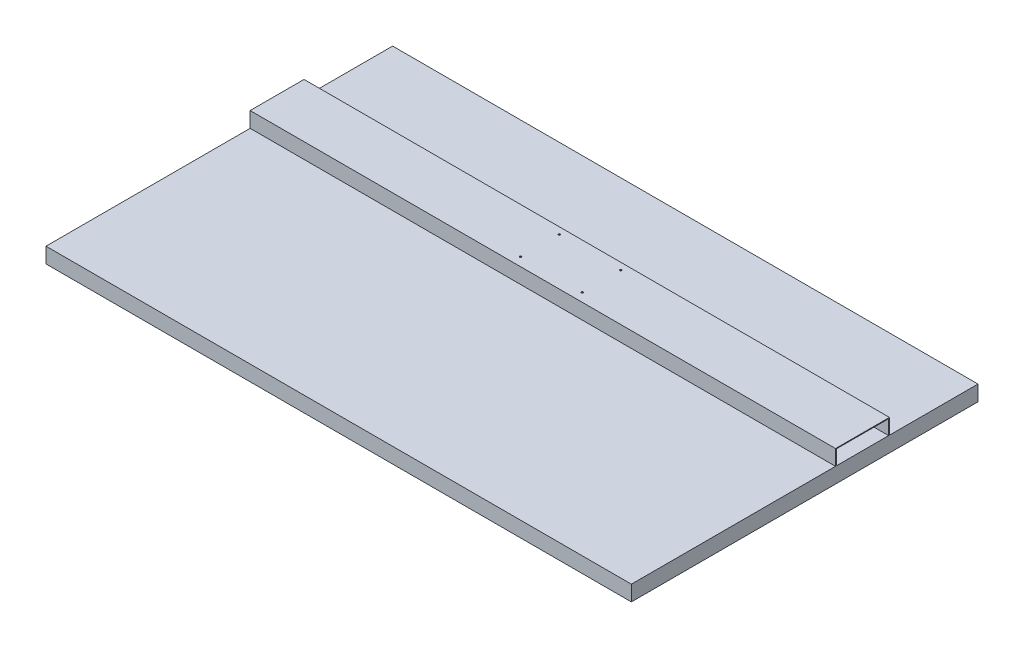
ISO-10303-21;
HEADER;
FILE_DESCRIPTION(('STEP AP214'),'2;1');
FILE_NAME('part.step','',(''),(''),'','','');
FILE_SCHEMA(('AUTOMOTIVE_DESIGN { 1 0 10303 214 1 1 1 1 }'));
ENDSEC;
DATA;
#1=APPLICATION_CONTEXT('core data for automotive mechanical design processes');
#2=APPLICATION_PROTOCOL_DEFINITION('international standard','automotive_design',2000,#1);
#3=PRODUCT_CONTEXT('',#1,'mechanical');
#4=PRODUCT('Part','Part','',(#3));
#5=PRODUCT_RELATED_PRODUCT_CATEGORY('part','',(#4));
#6=PRODUCT_DEFINITION_FORMATION('','',#4);
#7=PRODUCT_DEFINITION_CONTEXT('part definition',#1,'design');
#8=PRODUCT_DEFINITION('design','',#6,#7);
#9=PRODUCT_DEFINITION_SHAPE('','',#8);
#10=(LENGTH_UNIT() NAMED_UNIT(*) SI_UNIT(.MILLI.,.METRE.));
#11=(NAMED_UNIT(*) PLANE_ANGLE_UNIT() SI_UNIT($,.RADIAN.));
#12=(NAMED_UNIT(*) SI_UNIT($,.STERADIAN.) SOLID_ANGLE_UNIT());
#13=UNCERTAINTY_MEASURE_WITH_UNIT(LENGTH_MEASURE(1.E-05),#10,'distance_accuracy_value','');
#14=(GEOMETRIC_REPRESENTATION_CONTEXT(3) GLOBAL_UNCERTAINTY_ASSIGNED_CONTEXT((#13)) GLOBAL_UNIT_ASSIGNED_CONTEXT((#10,
#11,#12)) REPRESENTATION_CONTEXT('',''));
#15=CARTESIAN_POINT('',(0.,0.,0.));
#16=DIRECTION('',(0.,0.,1.));
#17=DIRECTION('',(1.,0.,0.));
#18=AXIS2_PLACEMENT_3D('',#15,#16,#17);
#19=CARTESIAN_POINT('',(0.,50.8,0.));
#20=DIRECTION('',(0.,1.,0.));
#21=DIRECTION('',(0.,0.,1.));
#22=AXIS2_PLACEMENT_3D('',#19,#20,#21);
#23=PLANE('',#22);
#24=DIRECTION('',(1.,0.,0.));
#25=VECTOR('',#24,1.);
#26=CARTESIAN_POINT('',(-965.2,50.8,-279.4));
#27=LINE('',#26,#25);
#28=CARTESIAN_POINT('',(-965.2,50.8,-279.4));
#29=VERTEX_POINT('',#28);
#30=CARTESIAN_POINT('',(965.199999999999,50.8,-279.4));
#31=VERTEX_POINT('',#30);
#32=EDGE_CURVE('E211',#29,#31,#27,.T.);
#33=ORIENTED_EDGE('',*,*,#32,.T.);
#34=DIRECTION('',(0.,0.,-1.));
#35=VECTOR('',#34,1.);
#36=CARTESIAN_POINT('',(965.199999999999,50.8,-571.5));
#37=LINE('',#36,#35);
#38=CARTESIAN_POINT('',(965.199999999999,50.8,-571.5));
#39=VERTEX_POINT('',#38);
#40=EDGE_CURVE('E255',#31,#39,#37,.T.);
#41=ORIENTED_EDGE('',*,*,#40,.T.);
#42=DIRECTION('',(-1.,0.,0.));
#43=VECTOR('',#42,1.);
#44=CARTESIAN_POINT('',(-965.2,50.8,-571.5));
#45=LINE('',#44,#43);
#46=CARTESIAN_POINT('',(-965.2,50.8,-571.5));
#47=VERTEX_POINT('',#46);
#48=EDGE_CURVE('E253',#39,#47,#45,.T.);
#49=ORIENTED_EDGE('',*,*,#48,.T.);
#50=DIRECTION('',(0.,0.,1.));
#51=VECTOR('',#50,1.);
#52=CARTESIAN_POINT('',(-965.2,50.8,-571.5));
#53=LINE('',#52,#51);
#54=EDGE_CURVE('E258',#47,#29,#53,.T.);
#55=ORIENTED_EDGE('',*,*,#54,.T.);
#56=EDGE_LOOP('',(#33,#41,#49,#55));
#57=FACE_BOUND('',#56,.T.);
#58=ADVANCED_FACE('F41',(#57),#23,.T.);
#59=DIRECTION('',(1.,0.,0.));
#60=VECTOR('',#59,1.);
#61=CARTESIAN_POINT('',(-965.2,50.8,-101.6));
#62=LINE('',#61,#60);
#63=CARTESIAN_POINT('',(-965.2,50.8,-101.6));
#64=VERTEX_POINT('',#63);
#65=CARTESIAN_POINT('',(965.199999999999,50.8,-101.6));
#66=VERTEX_POINT('',#65);
#67=EDGE_CURVE('E56',#64,#66,#62,.T.);
#68=ORIENTED_EDGE('',*,*,#67,.F.);
#69=CARTESIAN_POINT('',(-965.2,50.8,571.5));
#70=VERTEX_POINT('',#69);
#71=EDGE_CURVE('E257',#64,#70,#53,.T.);
#72=ORIENTED_EDGE('',*,*,#71,.T.);
#73=DIRECTION('',(1.,0.,0.));
#74=VECTOR('',#73,1.);
#75=CARTESIAN_POINT('',(-965.2,50.8,571.5));
#76=LINE('',#75,#74);
#77=CARTESIAN_POINT('',(965.2,50.8,571.5));
#78=VERTEX_POINT('',#77);
#79=EDGE_CURVE('E260',#70,#78,#76,.T.);
#80=ORIENTED_EDGE('',*,*,#79,.T.);
#81=EDGE_CURVE('E251',#78,#66,#37,.T.);
#82=ORIENTED_EDGE('',*,*,#81,.T.);
#83=EDGE_LOOP('',(#68,#72,#80,#82));
#84=FACE_BOUND('',#83,.T.);
#85=ADVANCED_FACE('F298',(#84),#23,.T.);
#86=CARTESIAN_POINT('',(0.,0.,0.));
#87=DIRECTION('',(0.,1.,0.));
#88=DIRECTION('',(0.,0.,1.));
#89=AXIS2_PLACEMENT_3D('',#86,#87,#88);
#90=PLANE('',#89);
#91=DIRECTION('',(0.,0.,-1.));
#92=VECTOR('',#91,1.);
#93=CARTESIAN_POINT('',(965.199999999999,0.,-571.5));
#94=LINE('',#93,#92);
#95=CARTESIAN_POINT('',(965.2,0.,571.5));
#96=VERTEX_POINT('',#95);
#97=CARTESIAN_POINT('',(965.199999999999,0.,-571.5));
#98=VERTEX_POINT('',#97);
#99=EDGE_CURVE('E250',#96,#98,#94,.T.);
#100=ORIENTED_EDGE('',*,*,#99,.F.);
#101=DIRECTION('',(1.,0.,0.));
#102=VECTOR('',#101,1.);
#103=CARTESIAN_POINT('',(-965.2,0.,571.5));
#104=LINE('',#103,#102);
#105=CARTESIAN_POINT('',(-965.2,0.,571.5));
#106=VERTEX_POINT('',#105);
#107=EDGE_CURVE('E269',#106,#96,#104,.T.);
#108=ORIENTED_EDGE('',*,*,#107,.F.);
#109=DIRECTION('',(0.,0.,1.));
#110=VECTOR('',#109,1.);
#111=CARTESIAN_POINT('',(-965.2,0.,-571.5));
#112=LINE('',#111,#110);
#113=CARTESIAN_POINT('',(-965.2,0.,-571.5));
#114=VERTEX_POINT('',#113);
#115=EDGE_CURVE('E267',#114,#106,#112,.T.);
#116=ORIENTED_EDGE('',*,*,#115,.F.);
#117=DIRECTION('',(-1.,0.,0.));
#118=VECTOR('',#117,1.);
#119=CARTESIAN_POINT('',(-965.2,0.,-571.5));
#120=LINE('',#119,#118);
#121=EDGE_CURVE('E265',#98,#114,#120,.T.);
#122=ORIENTED_EDGE('',*,*,#121,.F.);
#123=EDGE_LOOP('',(#100,#108,#116,#122));
#124=FACE_BOUND('',#123,.T.);
#125=DIRECTION('',(0.,0.,-1.));
#126=VECTOR('',#125,1.);
#127=CARTESIAN_POINT('',(930.881156145277,0.,-534.820170657997));
#128=LINE('',#127,#126);
#129=CARTESIAN_POINT('',(930.881156145277,0.,534.820170657998));
#130=VERTEX_POINT('',#129);
#131=CARTESIAN_POINT('',(930.881156145277,0.,-534.820170657997));
#132=VERTEX_POINT('',#131);
#133=EDGE_CURVE('E208',#130,#132,#128,.T.);
#134=ORIENTED_EDGE('',*,*,#133,.T.);
#135=DIRECTION('',(-1.,0.,0.));
#136=VECTOR('',#135,1.);
#137=CARTESIAN_POINT('',(-930.881156145277,0.,-534.820170657997));
#138=LINE('',#137,#136);
#139=CARTESIAN_POINT('',(-930.881156145277,0.,-534.820170657997));
#140=VERTEX_POINT('',#139);
#141=EDGE_CURVE('E233',#132,#140,#138,.T.);
#142=ORIENTED_EDGE('',*,*,#141,.T.);
#143=DIRECTION('',(0.,0.,1.));
#144=VECTOR('',#143,1.);
#145=CARTESIAN_POINT('',(-930.881156145277,0.,-534.820170657997));
#146=LINE('',#145,#144);
#147=CARTESIAN_POINT('',(-930.881156145277,0.,534.820170657998));
#148=VERTEX_POINT('',#147);
#149=EDGE_CURVE('E236',#140,#148,#146,.T.);
#150=ORIENTED_EDGE('',*,*,#149,.T.);
#151=DIRECTION('',(1.,0.,0.));
#152=VECTOR('',#151,1.);
#153=CARTESIAN_POINT('',(-930.881156145277,0.,534.820170657998));
#154=LINE('',#153,#152);
#155=EDGE_CURVE('E224',#148,#130,#154,.T.);
#156=ORIENTED_EDGE('',*,*,#155,.T.);
#157=EDGE_LOOP('',(#134,#142,#150,#156));
#158=FACE_BOUND('',#157,.T.);
#159=ADVANCED_FACE('F287',(#124,#158),#90,.F.);
#160=CARTESIAN_POINT('',(965.199999999999,50.8,-571.5));
#161=DIRECTION('',(-1.,0.,0.));
#162=DIRECTION('',(0.,0.,1.));
#163=AXIS2_PLACEMENT_3D('',#160,#161,#162);
#164=PLANE('',#163);
#165=ORIENTED_EDGE('',*,*,#40,.F.);
#166=DIRECTION('',(0.,1.,0.));
#167=VECTOR('',#166,1.);
#168=CARTESIAN_POINT('',(965.199999999999,50.8,-279.4));
#169=LINE('',#168,#167);
#170=CARTESIAN_POINT('',(965.199999999999,101.6,-279.4));
#171=VERTEX_POINT('',#170);
#172=EDGE_CURVE('E201',#31,#171,#169,.T.);
#173=ORIENTED_EDGE('',*,*,#172,.T.);
#174=DIRECTION('',(0.,0.,1.));
#175=VECTOR('',#174,1.);
#176=CARTESIAN_POINT('',(965.199999999999,101.6,-101.6));
#177=LINE('',#176,#175);
#178=CARTESIAN_POINT('',(965.199999999999,101.6,-101.6));
#179=VERTEX_POINT('',#178);
#180=EDGE_CURVE('E180',#171,#179,#177,.T.);
#181=ORIENTED_EDGE('',*,*,#180,.T.);
#182=DIRECTION('',(0.,-1.,0.));
#183=VECTOR('',#182,1.);
#184=CARTESIAN_POINT('',(965.199999999999,50.8,-101.6));
#185=LINE('',#184,#183);
#186=EDGE_CURVE('E191',#179,#66,#185,.T.);
#187=ORIENTED_EDGE('',*,*,#186,.T.);
#188=ORIENTED_EDGE('',*,*,#81,.F.);
#189=DIRECTION('',(0.,-1.,0.));
#190=VECTOR('',#189,1.);
#191=CARTESIAN_POINT('',(965.2,50.8,571.5));
#192=LINE('',#191,#190);
#193=EDGE_CURVE('E262',#78,#96,#192,.T.);
#194=ORIENTED_EDGE('',*,*,#193,.T.);
#195=ORIENTED_EDGE('',*,*,#99,.T.);
#196=DIRECTION('',(0.,-1.,0.));
#197=VECTOR('',#196,1.);
#198=CARTESIAN_POINT('',(965.199999999999,50.8,-571.5));
#199=LINE('',#198,#197);
#200=EDGE_CURVE('E11',#39,#98,#199,.T.);
#201=ORIENTED_EDGE('',*,*,#200,.F.);
#202=EDGE_LOOP('',(#165,#173,#181,#187,#188,#194,#195,#201));
#203=FACE_BOUND('',#202,.T.);
#204=DIRECTION('',(0.,-1.,0.));
#205=VECTOR('',#204,1.);
#206=CARTESIAN_POINT('',(965.199999999999,50.8,-276.86));
#207=LINE('',#206,#205);
#208=CARTESIAN_POINT('',(965.199999999999,99.06,-276.86));
#209=VERTEX_POINT('',#208);
#210=CARTESIAN_POINT('',(965.199999999999,50.8,-276.86));
#211=VERTEX_POINT('',#210);
#212=EDGE_CURVE('E198',#209,#211,#207,.T.);
#213=ORIENTED_EDGE('',*,*,#212,.T.);
#214=CARTESIAN_POINT('',(965.199999999999,50.8,-104.14));
#215=VERTEX_POINT('',#214);
#216=EDGE_CURVE('E254',#215,#211,#37,.T.);
#217=ORIENTED_EDGE('',*,*,#216,.F.);
#218=DIRECTION('',(0.,1.,0.));
#219=VECTOR('',#218,1.);
#220=CARTESIAN_POINT('',(965.199999999999,50.8,-104.14));
#221=LINE('',#220,#219);
#222=CARTESIAN_POINT('',(965.199999999999,99.06,-104.14));
#223=VERTEX_POINT('',#222);
#224=EDGE_CURVE('E194',#215,#223,#221,.T.);
#225=ORIENTED_EDGE('',*,*,#224,.T.);
#226=DIRECTION('',(0.,0.,-1.));
#227=VECTOR('',#226,1.);
#228=CARTESIAN_POINT('',(965.199999999999,99.06,-104.14));
#229=LINE('',#228,#227);
#230=EDGE_CURVE('E160',#223,#209,#229,.T.);
#231=ORIENTED_EDGE('',*,*,#230,.T.);
#232=EDGE_LOOP('',(#213,#217,#225,#231));
#233=FACE_BOUND('',#232,.T.);
#234=ADVANCED_FACE('F43',(#203,#233),#164,.F.);
#235=CARTESIAN_POINT('',(-965.2,50.8,-571.5));
#236=DIRECTION('',(0.,0.,1.));
#237=DIRECTION('',(1.,0.,0.));
#238=AXIS2_PLACEMENT_3D('',#235,#236,#237);
#239=PLANE('',#238);
#240=ORIENTED_EDGE('',*,*,#121,.T.);
#241=DIRECTION('',(0.,-1.,0.));
#242=VECTOR('',#241,1.);
#243=CARTESIAN_POINT('',(-965.2,50.8,-571.5));
#244=LINE('',#243,#242);
#245=EDGE_CURVE('E49',#47,#114,#244,.T.);
#246=ORIENTED_EDGE('',*,*,#245,.F.);
#247=ORIENTED_EDGE('',*,*,#48,.F.);
#248=ORIENTED_EDGE('',*,*,#200,.T.);
#249=EDGE_LOOP('',(#240,#246,#247,#248));
#250=FACE_BOUND('',#249,.T.);
#251=ADVANCED_FACE('F311',(#250),#239,.F.);
#252=CARTESIAN_POINT('',(-965.2,50.8,-571.5));
#253=DIRECTION('',(1.,0.,0.));
#254=DIRECTION('',(0.,0.,-1.));
#255=AXIS2_PLACEMENT_3D('',#252,#253,#254);
#256=PLANE('',#255);
#257=DIRECTION('',(0.,1.,0.));
#258=VECTOR('',#257,1.);
#259=CARTESIAN_POINT('',(-965.2,50.8,-279.4));
#260=LINE('',#259,#258);
#261=CARTESIAN_POINT('',(-965.2,101.6,-279.4));
#262=VERTEX_POINT('',#261);
#263=EDGE_CURVE('E185',#29,#262,#260,.T.);
#264=ORIENTED_EDGE('',*,*,#263,.F.);
#265=ORIENTED_EDGE('',*,*,#54,.F.);
#266=ORIENTED_EDGE('',*,*,#245,.T.);
#267=ORIENTED_EDGE('',*,*,#115,.T.);
#268=DIRECTION('',(0.,-1.,0.));
#269=VECTOR('',#268,1.);
#270=CARTESIAN_POINT('',(-965.2,50.8,571.5));
#271=LINE('',#270,#269);
#272=EDGE_CURVE('E273',#70,#106,#271,.T.);
#273=ORIENTED_EDGE('',*,*,#272,.F.);
#274=ORIENTED_EDGE('',*,*,#71,.F.);
#275=DIRECTION('',(0.,-1.,0.));
#276=VECTOR('',#275,1.);
#277=CARTESIAN_POINT('',(-965.2,50.8,-101.6));
#278=LINE('',#277,#276);
#279=CARTESIAN_POINT('',(-965.2,101.6,-101.6));
#280=VERTEX_POINT('',#279);
#281=EDGE_CURVE('E177',#280,#64,#278,.T.);
#282=ORIENTED_EDGE('',*,*,#281,.F.);
#283=DIRECTION('',(0.,0.,1.));
#284=VECTOR('',#283,1.);
#285=CARTESIAN_POINT('',(-965.2,101.6,-101.6));
#286=LINE('',#285,#284);
#287=EDGE_CURVE('E188',#262,#280,#286,.T.);
#288=ORIENTED_EDGE('',*,*,#287,.F.);
#289=EDGE_LOOP('',(#264,#265,#266,#267,#273,#274,#282,#288));
#290=FACE_BOUND('',#289,.T.);
#291=CARTESIAN_POINT('',(-965.2,50.8,-276.86));
#292=VERTEX_POINT('',#291);
#293=CARTESIAN_POINT('',(-965.2,50.8,-104.14));
#294=VERTEX_POINT('',#293);
#295=EDGE_CURVE('E64',#292,#294,#53,.T.);
#296=ORIENTED_EDGE('',*,*,#295,.F.);
#297=DIRECTION('',(0.,-1.,0.));
#298=VECTOR('',#297,1.);
#299=CARTESIAN_POINT('',(-965.2,50.8,-276.86));
#300=LINE('',#299,#298);
#301=CARTESIAN_POINT('',(-965.2,99.06,-276.86));
#302=VERTEX_POINT('',#301);
#303=EDGE_CURVE('E174',#302,#292,#300,.T.);
#304=ORIENTED_EDGE('',*,*,#303,.F.);
#305=DIRECTION('',(0.,0.,-1.));
#306=VECTOR('',#305,1.);
#307=CARTESIAN_POINT('',(-965.2,99.06,-104.14));
#308=LINE('',#307,#306);
#309=CARTESIAN_POINT('',(-965.2,99.06,-104.14));
#310=VERTEX_POINT('',#309);
#311=EDGE_CURVE('E158',#310,#302,#308,.T.);
#312=ORIENTED_EDGE('',*,*,#311,.F.);
#313=DIRECTION('',(0.,1.,0.));
#314=VECTOR('',#313,1.);
#315=CARTESIAN_POINT('',(-965.2,50.8,-104.14));
#316=LINE('',#315,#314);
#317=EDGE_CURVE('E172',#294,#310,#316,.T.);
#318=ORIENTED_EDGE('',*,*,#317,.F.);
#319=EDGE_LOOP('',(#296,#304,#312,#318));
#320=FACE_BOUND('',#319,.T.);
#321=ADVANCED_FACE('F171',(#290,#320),#256,.F.);
#322=CARTESIAN_POINT('',(-965.2,50.8,571.5));
#323=DIRECTION('',(0.,0.,-1.));
#324=DIRECTION('',(-1.,0.,0.));
#325=AXIS2_PLACEMENT_3D('',#322,#323,#324);
#326=PLANE('',#325);
#327=ORIENTED_EDGE('',*,*,#107,.T.);
#328=ORIENTED_EDGE('',*,*,#193,.F.);
#329=ORIENTED_EDGE('',*,*,#79,.F.);
#330=ORIENTED_EDGE('',*,*,#272,.T.);
#331=EDGE_LOOP('',(#327,#328,#329,#330));
#332=FACE_BOUND('',#331,.T.);
#333=ADVANCED_FACE('F291',(#332),#326,.F.);
#334=DIRECTION('',(1.,0.,0.));
#335=VECTOR('',#334,1.);
#336=CARTESIAN_POINT('',(-965.2,50.8,-276.86));
#337=LINE('',#336,#335);
#338=EDGE_CURVE('E214',#292,#211,#337,.T.);
#339=ORIENTED_EDGE('',*,*,#338,.F.);
#340=ORIENTED_EDGE('',*,*,#295,.T.);
#341=DIRECTION('',(1.,0.,0.));
#342=VECTOR('',#341,1.);
#343=CARTESIAN_POINT('',(-965.2,50.8,-104.14));
#344=LINE('',#343,#342);
#345=EDGE_CURVE('E166',#294,#215,#344,.T.);
#346=ORIENTED_EDGE('',*,*,#345,.T.);
#347=ORIENTED_EDGE('',*,*,#216,.T.);
#348=EDGE_LOOP('',(#339,#340,#346,#347));
#349=FACE_BOUND('',#348,.T.);
#350=ADVANCED_FACE('F312',(#349),#23,.T.);
#351=CARTESIAN_POINT('',(930.881156145277,3.048,-534.820170657997));
#352=DIRECTION('',(-1.,0.,0.));
#353=DIRECTION('',(0.,0.,1.));
#354=AXIS2_PLACEMENT_3D('',#351,#352,#353);
#355=PLANE('',#354);
#356=ORIENTED_EDGE('',*,*,#133,.F.);
#357=DIRECTION('',(0.,-1.,0.));
#358=VECTOR('',#357,1.);
#359=CARTESIAN_POINT('',(930.881156145277,3.048,534.820170657998));
#360=LINE('',#359,#358);
#361=CARTESIAN_POINT('',(930.881156145277,3.048,534.820170657998));
#362=VERTEX_POINT('',#361);
#363=EDGE_CURVE('E230',#362,#130,#360,.T.);
#364=ORIENTED_EDGE('',*,*,#363,.F.);
#365=DIRECTION('',(0.,0.,-1.));
#366=VECTOR('',#365,1.);
#367=CARTESIAN_POINT('',(930.881156145277,3.048,-534.820170657997));
#368=LINE('',#367,#366);
#369=CARTESIAN_POINT('',(930.881156145277,3.048,-534.820170657997));
#370=VERTEX_POINT('',#369);
#371=EDGE_CURVE('E220',#362,#370,#368,.T.);
#372=ORIENTED_EDGE('',*,*,#371,.T.);
#373=DIRECTION('',(0.,-1.,0.));
#374=VECTOR('',#373,1.);
#375=CARTESIAN_POINT('',(930.881156145277,3.048,-534.820170657997));
#376=LINE('',#375,#374);
#377=EDGE_CURVE('E247',#370,#132,#376,.T.);
#378=ORIENTED_EDGE('',*,*,#377,.T.);
#379=EDGE_LOOP('',(#356,#364,#372,#378));
#380=FACE_BOUND('',#379,.T.);
#381=ADVANCED_FACE('F332',(#380),#355,.T.);
#382=CARTESIAN_POINT('',(-930.881156145277,3.048,-534.820170657997));
#383=DIRECTION('',(0.,0.,1.));
#384=DIRECTION('',(1.,0.,0.));
#385=AXIS2_PLACEMENT_3D('',#382,#383,#384);
#386=PLANE('',#385);
#387=ORIENTED_EDGE('',*,*,#141,.F.);
#388=ORIENTED_EDGE('',*,*,#377,.F.);
#389=DIRECTION('',(-1.,0.,0.));
#390=VECTOR('',#389,1.);
#391=CARTESIAN_POINT('',(-930.881156145277,3.048,-534.820170657997));
#392=LINE('',#391,#390);
#393=CARTESIAN_POINT('',(-930.881156145277,3.048,-534.820170657997));
#394=VERTEX_POINT('',#393);
#395=EDGE_CURVE('E223',#370,#394,#392,.T.);
#396=ORIENTED_EDGE('',*,*,#395,.T.);
#397=DIRECTION('',(0.,-1.,0.));
#398=VECTOR('',#397,1.);
#399=CARTESIAN_POINT('',(-930.881156145277,3.048,-534.820170657997));
#400=LINE('',#399,#398);
#401=EDGE_CURVE('E245',#394,#140,#400,.T.);
#402=ORIENTED_EDGE('',*,*,#401,.T.);
#403=EDGE_LOOP('',(#387,#388,#396,#402));
#404=FACE_BOUND('',#403,.T.);
#405=ADVANCED_FACE('F338',(#404),#386,.T.);
#406=CARTESIAN_POINT('',(-930.881156145277,3.048,-534.820170657997));
#407=DIRECTION('',(1.,0.,0.));
#408=DIRECTION('',(0.,0.,-1.));
#409=AXIS2_PLACEMENT_3D('',#406,#407,#408);
#410=PLANE('',#409);
#411=ORIENTED_EDGE('',*,*,#149,.F.);
#412=ORIENTED_EDGE('',*,*,#401,.F.);
#413=DIRECTION('',(0.,0.,1.));
#414=VECTOR('',#413,1.);
#415=CARTESIAN_POINT('',(-930.881156145277,3.048,-534.820170657997));
#416=LINE('',#415,#414);
#417=CARTESIAN_POINT('',(-930.881156145277,3.048,534.820170657998));
#418=VERTEX_POINT('',#417);
#419=EDGE_CURVE('E226',#394,#418,#416,.T.);
#420=ORIENTED_EDGE('',*,*,#419,.T.);
#421=DIRECTION('',(0.,-1.,0.));
#422=VECTOR('',#421,1.);
#423=CARTESIAN_POINT('',(-930.881156145277,3.048,534.820170657998));
#424=LINE('',#423,#422);
#425=EDGE_CURVE('E243',#418,#148,#424,.T.);
#426=ORIENTED_EDGE('',*,*,#425,.T.);
#427=EDGE_LOOP('',(#411,#412,#420,#426));
#428=FACE_BOUND('',#427,.T.);
#429=ADVANCED_FACE('F475',(#428),#410,.T.);
#430=CARTESIAN_POINT('',(-930.881156145277,3.048,534.820170657998));
#431=DIRECTION('',(0.,0.,-1.));
#432=DIRECTION('',(-1.,0.,0.));
#433=AXIS2_PLACEMENT_3D('',#430,#431,#432);
#434=PLANE('',#433);
#435=ORIENTED_EDGE('',*,*,#155,.F.);
#436=ORIENTED_EDGE('',*,*,#425,.F.);
#437=DIRECTION('',(1.,0.,0.));
#438=VECTOR('',#437,1.);
#439=CARTESIAN_POINT('',(-930.881156145277,3.048,534.820170657998));
#440=LINE('',#439,#438);
#441=EDGE_CURVE('E228',#418,#362,#440,.T.);
#442=ORIENTED_EDGE('',*,*,#441,.T.);
#443=ORIENTED_EDGE('',*,*,#363,.T.);
#444=EDGE_LOOP('',(#435,#436,#442,#443));
#445=FACE_BOUND('',#444,.T.);
#446=ADVANCED_FACE('F466',(#445),#434,.T.);
#447=CARTESIAN_POINT('',(0.,3.048,0.));
#448=DIRECTION('',(0.,1.,0.));
#449=DIRECTION('',(0.,0.,1.));
#450=AXIS2_PLACEMENT_3D('',#447,#448,#449);
#451=PLANE('',#450);
#452=ORIENTED_EDGE('',*,*,#371,.F.);
#453=ORIENTED_EDGE('',*,*,#441,.F.);
#454=ORIENTED_EDGE('',*,*,#419,.F.);
#455=ORIENTED_EDGE('',*,*,#395,.F.);
#456=EDGE_LOOP('',(#452,#453,#454,#455));
#457=FACE_BOUND('',#456,.T.);
#458=ADVANCED_FACE('F351',(#457),#451,.F.);
#459=CARTESIAN_POINT('',(-965.2,50.8,-101.6));
#460=DIRECTION('',(0.,0.,1.));
#461=DIRECTION('',(0.,-1.,0.));
#462=AXIS2_PLACEMENT_3D('',#459,#460,#461);
#463=PLANE('',#462);
#464=ORIENTED_EDGE('',*,*,#186,.F.);
#465=DIRECTION('',(1.,0.,0.));
#466=VECTOR('',#465,1.);
#467=CARTESIAN_POINT('',(-965.2,101.6,-101.6));
#468=LINE('',#467,#466);
#469=EDGE_CURVE('E206',#280,#179,#468,.T.);
#470=ORIENTED_EDGE('',*,*,#469,.F.);
#471=ORIENTED_EDGE('',*,*,#281,.T.);
#472=ORIENTED_EDGE('',*,*,#67,.T.);
#473=EDGE_LOOP('',(#464,#470,#471,#472));
#474=FACE_BOUND('',#473,.T.);
#475=ADVANCED_FACE('F300',(#474),#463,.T.);
#476=CARTESIAN_POINT('',(-965.2,101.6,-101.6));
#477=DIRECTION('',(0.,1.,0.));
#478=DIRECTION('',(0.,0.,1.));
#479=AXIS2_PLACEMENT_3D('',#476,#477,#478);
#480=PLANE('',#479);
#481=CARTESIAN_POINT('',(101.6,101.6,-257.175));
#482=DIRECTION('',(0.,1.,0.));
#483=DIRECTION('',(0.,0.,1.));
#484=AXIS2_PLACEMENT_3D('',#481,#482,#483);
#485=CIRCLE('',#484,3.17499999999997);
#486=CARTESIAN_POINT('',(101.6,101.6,-254.));
#487=VERTEX_POINT('',#486);
#488=EDGE_CURVE('E537',#487,#487,#485,.T.);
#489=ORIENTED_EDGE('',*,*,#488,.F.);
#490=EDGE_LOOP('',(#489));
#491=FACE_BOUND('',#490,.T.);
#492=CARTESIAN_POINT('',(-101.6,101.6,-257.175));
#493=DIRECTION('',(0.,1.,0.));
#494=DIRECTION('',(0.,0.,1.));
#495=AXIS2_PLACEMENT_3D('',#492,#493,#494);
#496=CIRCLE('',#495,3.175);
#497=CARTESIAN_POINT('',(-101.6,101.6,-254.));
#498=VERTEX_POINT('',#497);
#499=EDGE_CURVE('E539',#498,#498,#496,.T.);
#500=ORIENTED_EDGE('',*,*,#499,.F.);
#501=EDGE_LOOP('',(#500));
#502=FACE_BOUND('',#501,.T.);
#503=CARTESIAN_POINT('',(-101.6,101.6,-130.175));
#504=DIRECTION('',(0.,1.,0.));
#505=DIRECTION('',(0.,0.,1.));
#506=AXIS2_PLACEMENT_3D('',#503,#504,#505);
#507=CIRCLE('',#506,3.175);
#508=CARTESIAN_POINT('',(-101.6,101.6,-127.));
#509=VERTEX_POINT('',#508);
#510=EDGE_CURVE('E550',#509,#509,#507,.T.);
#511=ORIENTED_EDGE('',*,*,#510,.F.);
#512=EDGE_LOOP('',(#511));
#513=FACE_BOUND('',#512,.T.);
#514=CARTESIAN_POINT('',(101.6,101.6,-130.175));
#515=DIRECTION('',(0.,1.,0.));
#516=DIRECTION('',(0.,0.,1.));
#517=AXIS2_PLACEMENT_3D('',#514,#515,#516);
#518=CIRCLE('',#517,3.17499999999997);
#519=CARTESIAN_POINT('',(101.6,101.6,-127.));
#520=VERTEX_POINT('',#519);
#521=EDGE_CURVE('E544',#520,#520,#518,.T.);
#522=ORIENTED_EDGE('',*,*,#521,.F.);
#523=EDGE_LOOP('',(#522));
#524=FACE_BOUND('',#523,.T.);
#525=ORIENTED_EDGE('',*,*,#180,.F.);
#526=DIRECTION('',(1.,0.,0.));
#527=VECTOR('',#526,1.);
#528=CARTESIAN_POINT('',(-965.2,101.6,-279.4));
#529=LINE('',#528,#527);
#530=EDGE_CURVE('E209',#262,#171,#529,.T.);
#531=ORIENTED_EDGE('',*,*,#530,.F.);
#532=ORIENTED_EDGE('',*,*,#287,.T.);
#533=ORIENTED_EDGE('',*,*,#469,.T.);
#534=EDGE_LOOP('',(#525,#531,#532,#533));
#535=FACE_BOUND('',#534,.T.);
#536=ADVANCED_FACE('F305',(#491,#502,#513,#524,#535),#480,.T.);
#537=CARTESIAN_POINT('',(-965.2,50.8,-279.4));
#538=DIRECTION('',(0.,0.,-1.));
#539=DIRECTION('',(-1.,0.,0.));
#540=AXIS2_PLACEMENT_3D('',#537,#538,#539);
#541=PLANE('',#540);
#542=ORIENTED_EDGE('',*,*,#172,.F.);
#543=ORIENTED_EDGE('',*,*,#32,.F.);
#544=ORIENTED_EDGE('',*,*,#263,.T.);
#545=ORIENTED_EDGE('',*,*,#530,.T.);
#546=EDGE_LOOP('',(#542,#543,#544,#545));
#547=FACE_BOUND('',#546,.T.);
#548=ADVANCED_FACE('F309',(#547),#541,.T.);
#549=CARTESIAN_POINT('',(-965.2,50.8,-276.86));
#550=DIRECTION('',(0.,0.,1.));
#551=DIRECTION('',(1.,0.,0.));
#552=AXIS2_PLACEMENT_3D('',#549,#550,#551);
#553=PLANE('',#552);
#554=ORIENTED_EDGE('',*,*,#212,.F.);
#555=DIRECTION('',(1.,0.,0.));
#556=VECTOR('',#555,1.);
#557=CARTESIAN_POINT('',(-965.2,99.06,-276.86));
#558=LINE('',#557,#556);
#559=EDGE_CURVE('E165',#302,#209,#558,.T.);
#560=ORIENTED_EDGE('',*,*,#559,.F.);
#561=ORIENTED_EDGE('',*,*,#303,.T.);
#562=ORIENTED_EDGE('',*,*,#338,.T.);
#563=EDGE_LOOP('',(#554,#560,#561,#562));
#564=FACE_BOUND('',#563,.T.);
#565=ADVANCED_FACE('F315',(#564),#553,.T.);
#566=CARTESIAN_POINT('',(-965.2,99.06,-104.14));
#567=DIRECTION('',(0.,-1.,0.));
#568=DIRECTION('',(0.,0.,-1.));
#569=AXIS2_PLACEMENT_3D('',#566,#567,#568);
#570=PLANE('',#569);
#571=CARTESIAN_POINT('',(101.6,99.06,-257.175));
#572=DIRECTION('',(0.,-1.,0.));
#573=DIRECTION('',(0.,0.,-1.));
#574=AXIS2_PLACEMENT_3D('',#571,#572,#573);
#575=CIRCLE('',#574,3.17499999999997);
#576=CARTESIAN_POINT('',(101.6,99.06,-260.35));
#577=VERTEX_POINT('',#576);
#578=EDGE_CURVE('E534',#577,#577,#575,.F.);
#579=ORIENTED_EDGE('',*,*,#578,.T.);
#580=EDGE_LOOP('',(#579));
#581=FACE_BOUND('',#580,.T.);
#582=CARTESIAN_POINT('',(-101.6,99.06,-257.175));
#583=DIRECTION('',(0.,-1.,0.));
#584=DIRECTION('',(0.,0.,-1.));
#585=AXIS2_PLACEMENT_3D('',#582,#583,#584);
#586=CIRCLE('',#585,3.175);
#587=CARTESIAN_POINT('',(-101.6,99.06,-260.35));
#588=VERTEX_POINT('',#587);
#589=EDGE_CURVE('E555',#588,#588,#586,.F.);
#590=ORIENTED_EDGE('',*,*,#589,.T.);
#591=EDGE_LOOP('',(#590));
#592=FACE_BOUND('',#591,.T.);
#593=CARTESIAN_POINT('',(-101.6,99.06,-130.175));
#594=DIRECTION('',(0.,-1.,0.));
#595=DIRECTION('',(0.,0.,-1.));
#596=AXIS2_PLACEMENT_3D('',#593,#594,#595);
#597=CIRCLE('',#596,3.175);
#598=CARTESIAN_POINT('',(-101.6,99.06,-133.35));
#599=VERTEX_POINT('',#598);
#600=EDGE_CURVE('E546',#599,#599,#597,.F.);
#601=ORIENTED_EDGE('',*,*,#600,.T.);
#602=EDGE_LOOP('',(#601));
#603=FACE_BOUND('',#602,.T.);
#604=CARTESIAN_POINT('',(101.6,99.06,-130.175));
#605=DIRECTION('',(0.,-1.,0.));
#606=DIRECTION('',(0.,0.,-1.));
#607=AXIS2_PLACEMENT_3D('',#604,#605,#606);
#608=CIRCLE('',#607,3.17499999999997);
#609=CARTESIAN_POINT('',(101.6,99.06,-133.35));
#610=VERTEX_POINT('',#609);
#611=EDGE_CURVE('E195',#610,#610,#608,.F.);
#612=ORIENTED_EDGE('',*,*,#611,.T.);
#613=EDGE_LOOP('',(#612));
#614=FACE_BOUND('',#613,.T.);
#615=ORIENTED_EDGE('',*,*,#230,.F.);
#616=DIRECTION('',(1.,0.,0.));
#617=VECTOR('',#616,1.);
#618=CARTESIAN_POINT('',(-965.2,99.06,-104.14));
#619=LINE('',#618,#617);
#620=EDGE_CURVE('E155',#310,#223,#619,.T.);
#621=ORIENTED_EDGE('',*,*,#620,.F.);
#622=ORIENTED_EDGE('',*,*,#311,.T.);
#623=ORIENTED_EDGE('',*,*,#559,.T.);
#624=EDGE_LOOP('',(#615,#621,#622,#623));
#625=FACE_BOUND('',#624,.T.);
#626=ADVANCED_FACE('F157',(#581,#592,#603,#614,#625),#570,.T.);
#627=CARTESIAN_POINT('',(-965.2,50.8,-104.14));
#628=DIRECTION('',(0.,0.,-1.));
#629=DIRECTION('',(-1.,0.,0.));
#630=AXIS2_PLACEMENT_3D('',#627,#628,#629);
#631=PLANE('',#630);
#632=ORIENTED_EDGE('',*,*,#224,.F.);
#633=ORIENTED_EDGE('',*,*,#345,.F.);
#634=ORIENTED_EDGE('',*,*,#317,.T.);
#635=ORIENTED_EDGE('',*,*,#620,.T.);
#636=EDGE_LOOP('',(#632,#633,#634,#635));
#637=FACE_BOUND('',#636,.T.);
#638=ADVANCED_FACE('F176',(#637),#631,.T.);
#639=CARTESIAN_POINT('',(101.6,-0.001000000000001,-130.175));
#640=DIRECTION('',(0.,1.,0.));
#641=DIRECTION('',(0.,0.,1.));
#642=AXIS2_PLACEMENT_3D('',#639,#640,#641);
#643=CYLINDRICAL_SURFACE('',#642,3.17499999999997);
#644=ORIENTED_EDGE('',*,*,#611,.F.);
#645=EDGE_LOOP('',(#644));
#646=FACE_BOUND('',#645,.T.);
#647=ORIENTED_EDGE('',*,*,#521,.T.);
#648=EDGE_LOOP('',(#647));
#649=FACE_BOUND('',#648,.T.);
#650=ADVANCED_FACE('F385',(#646,#649),#643,.F.);
#651=CARTESIAN_POINT('',(-101.6,-0.001000000000001,-130.175));
#652=DIRECTION('',(0.,1.,0.));
#653=DIRECTION('',(0.,0.,1.));
#654=AXIS2_PLACEMENT_3D('',#651,#652,#653);
#655=CYLINDRICAL_SURFACE('',#654,3.175);
#656=ORIENTED_EDGE('',*,*,#600,.F.);
#657=EDGE_LOOP('',(#656));
#658=FACE_BOUND('',#657,.T.);
#659=ORIENTED_EDGE('',*,*,#510,.T.);
#660=EDGE_LOOP('',(#659));
#661=FACE_BOUND('',#660,.T.);
#662=ADVANCED_FACE('F391',(#658,#661),#655,.F.);
#663=CARTESIAN_POINT('',(-101.6,-0.001000000000001,-257.175));
#664=DIRECTION('',(0.,1.,0.));
#665=DIRECTION('',(0.,0.,1.));
#666=AXIS2_PLACEMENT_3D('',#663,#664,#665);
#667=CYLINDRICAL_SURFACE('',#666,3.175);
#668=ORIENTED_EDGE('',*,*,#589,.F.);
#669=EDGE_LOOP('',(#668));
#670=FACE_BOUND('',#669,.T.);
#671=ORIENTED_EDGE('',*,*,#499,.T.);
#672=EDGE_LOOP('',(#671));
#673=FACE_BOUND('',#672,.T.);
#674=ADVANCED_FACE('F399',(#670,#673),#667,.F.);
#675=CARTESIAN_POINT('',(101.6,-0.001000000000001,-257.175));
#676=DIRECTION('',(0.,1.,0.));
#677=DIRECTION('',(0.,0.,1.));
#678=AXIS2_PLACEMENT_3D('',#675,#676,#677);
#679=CYLINDRICAL_SURFACE('',#678,3.17499999999997);
#680=ORIENTED_EDGE('',*,*,#578,.F.);
#681=EDGE_LOOP('',(#680));
#682=FACE_BOUND('',#681,.T.);
#683=ORIENTED_EDGE('',*,*,#488,.T.);
#684=EDGE_LOOP('',(#683));
#685=FACE_BOUND('',#684,.T.);
#686=ADVANCED_FACE('F407',(#682,#685),#679,.F.);
#687=CLOSED_SHELL('',(#58,#85,#159,#234,#251,#321,#333,#350,#381,#405,#429,#446,#458,#475,#536,
#548,#565,#626,#638,#650,#662,#674,#686));
#688=MANIFOLD_SOLID_BREP('B2',#687);
#689=ADVANCED_BREP_SHAPE_REPRESENTATION('',(#18,#688),#14);
#690=SHAPE_DEFINITION_REPRESENTATION(#9,#689);
ENDSEC;
END-ISO-10303-21;
